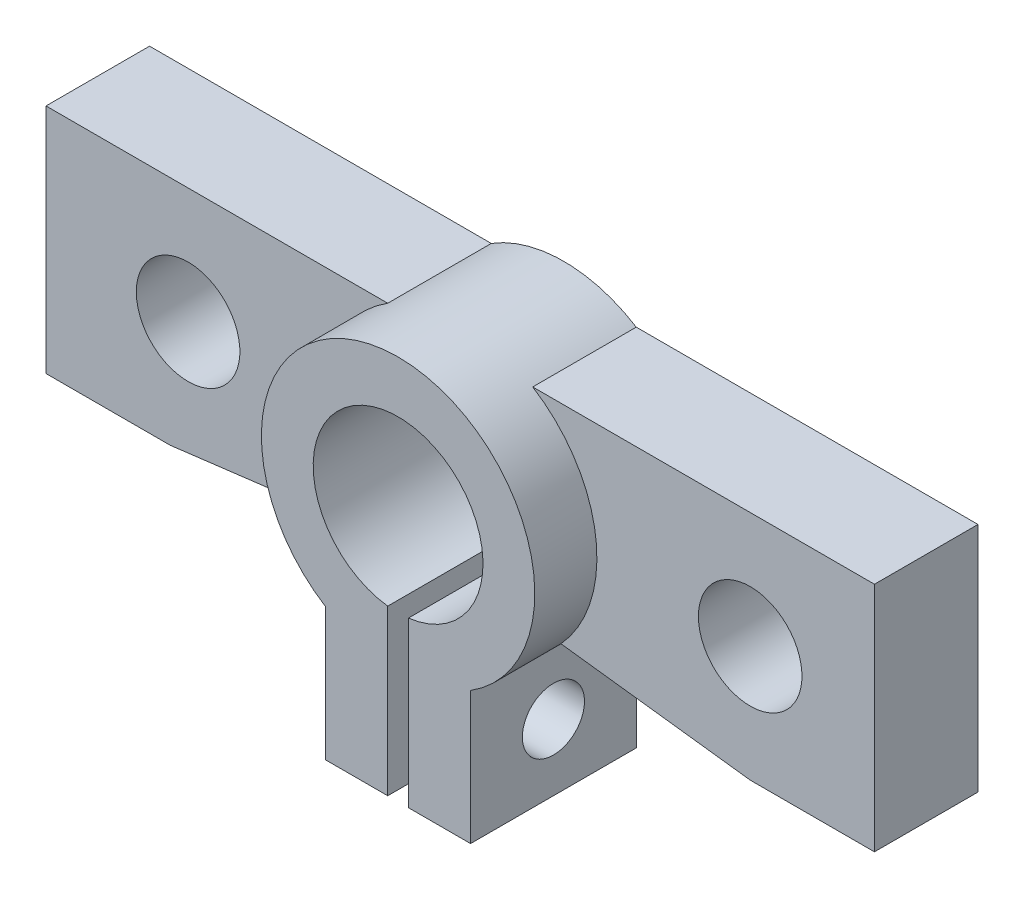
ISO-10303-21;
HEADER;
FILE_DESCRIPTION(('STEP AP214'),'2;1');
FILE_NAME('part.step','',(''),(''),'','','');
FILE_SCHEMA(('AUTOMOTIVE_DESIGN { 1 0 10303 214 1 1 1 1 }'));
ENDSEC;
DATA;
#1=APPLICATION_CONTEXT('core data for automotive mechanical design processes');
#2=APPLICATION_PROTOCOL_DEFINITION('international standard','automotive_design',2000,#1);
#3=PRODUCT_CONTEXT('',#1,'mechanical');
#4=PRODUCT('Part','Part','',(#3));
#5=PRODUCT_RELATED_PRODUCT_CATEGORY('part','',(#4));
#6=PRODUCT_DEFINITION_FORMATION('','',#4);
#7=PRODUCT_DEFINITION_CONTEXT('part definition',#1,'design');
#8=PRODUCT_DEFINITION('design','',#6,#7);
#9=PRODUCT_DEFINITION_SHAPE('','',#8);
#10=(LENGTH_UNIT() NAMED_UNIT(*) SI_UNIT(.MILLI.,.METRE.));
#11=(NAMED_UNIT(*) PLANE_ANGLE_UNIT() SI_UNIT($,.RADIAN.));
#12=(NAMED_UNIT(*) SI_UNIT($,.STERADIAN.) SOLID_ANGLE_UNIT());
#13=UNCERTAINTY_MEASURE_WITH_UNIT(LENGTH_MEASURE(1.E-05),#10,'distance_accuracy_value','');
#14=(GEOMETRIC_REPRESENTATION_CONTEXT(3) GLOBAL_UNCERTAINTY_ASSIGNED_CONTEXT((#13)) GLOBAL_UNIT_ASSIGNED_CONTEXT((#10,
#11,#12)) REPRESENTATION_CONTEXT('',''));
#15=CARTESIAN_POINT('',(0.,0.,0.));
#16=DIRECTION('',(0.,0.,1.));
#17=DIRECTION('',(1.,0.,0.));
#18=AXIS2_PLACEMENT_3D('',#15,#16,#17);
#19=CARTESIAN_POINT('',(0.,0.,8.));
#20=DIRECTION('',(0.,0.,-1.));
#21=DIRECTION('',(-1.,0.,0.));
#22=AXIS2_PLACEMENT_3D('',#19,#20,#21);
#23=CYLINDRICAL_SURFACE('',#22,6.6);
#24=DIRECTION('',(0.,0.,-1.));
#25=VECTOR('',#24,1.);
#26=CARTESIAN_POINT('',(3.50000000000012,5.59553393341503,5.));
#27=LINE('',#26,#25);
#28=CARTESIAN_POINT('',(3.50000000000012,5.59553393341503,5.));
#29=VERTEX_POINT('',#28);
#30=CARTESIAN_POINT('',(3.50000000000012,5.59553393341503,0.));
#31=VERTEX_POINT('',#30);
#32=EDGE_CURVE('E217',#29,#31,#27,.T.);
#33=ORIENTED_EDGE('',*,*,#32,.T.);
#34=CARTESIAN_POINT('',(0.,0.,0.));
#35=DIRECTION('',(0.,0.,1.));
#36=DIRECTION('',(1.,0.,0.));
#37=AXIS2_PLACEMENT_3D('',#34,#35,#36);
#38=CIRCLE('',#37,6.6);
#39=CARTESIAN_POINT('',(-3.50000000000012,5.59553393341503,0.));
#40=VERTEX_POINT('',#39);
#41=EDGE_CURVE('E307',#31,#40,#38,.T.);
#42=ORIENTED_EDGE('',*,*,#41,.T.);
#43=DIRECTION('',(0.,0.,-1.));
#44=VECTOR('',#43,1.);
#45=CARTESIAN_POINT('',(-3.50000000000012,5.59553393341503,5.));
#46=LINE('',#45,#44);
#47=CARTESIAN_POINT('',(-3.50000000000012,5.59553393341503,5.));
#48=VERTEX_POINT('',#47);
#49=EDGE_CURVE('E204',#48,#40,#46,.T.);
#50=ORIENTED_EDGE('',*,*,#49,.F.);
#51=CARTESIAN_POINT('',(0.,0.,5.));
#52=DIRECTION('',(0.,0.,-1.));
#53=DIRECTION('',(-1.,0.,0.));
#54=AXIS2_PLACEMENT_3D('',#51,#52,#53);
#55=CIRCLE('',#54,6.6);
#56=CARTESIAN_POINT('',(-4.86300158662899,-4.46219851289069,5.));
#57=VERTEX_POINT('',#56);
#58=EDGE_CURVE('E223',#57,#48,#55,.T.);
#59=ORIENTED_EDGE('',*,*,#58,.F.);
#60=DIRECTION('',(0.,0.,-1.));
#61=VECTOR('',#60,1.);
#62=CARTESIAN_POINT('',(-4.86300158662899,-4.46219851289069,5.));
#63=LINE('',#62,#61);
#64=CARTESIAN_POINT('',(-4.86300158662899,-4.46219851289069,0.));
#65=VERTEX_POINT('',#64);
#66=EDGE_CURVE('E236',#57,#65,#63,.T.);
#67=ORIENTED_EDGE('',*,*,#66,.T.);
#68=CARTESIAN_POINT('',(-3.49999999999988,-5.59553393341519,0.));
#69=VERTEX_POINT('',#68);
#70=EDGE_CURVE('E304',#65,#69,#38,.T.);
#71=ORIENTED_EDGE('',*,*,#70,.T.);
#72=DIRECTION('',(0.,0.,-1.));
#73=VECTOR('',#72,1.);
#74=CARTESIAN_POINT('',(-3.49999999999988,-5.59553393341519,8.));
#75=LINE('',#74,#73);
#76=CARTESIAN_POINT('',(-3.49999999999988,-5.59553393341519,8.));
#77=VERTEX_POINT('',#76);
#78=EDGE_CURVE('E311',#77,#69,#75,.T.);
#79=ORIENTED_EDGE('',*,*,#78,.F.);
#80=CARTESIAN_POINT('',(0.,0.,8.));
#81=DIRECTION('',(0.,0.,1.));
#82=DIRECTION('',(1.,0.,0.));
#83=AXIS2_PLACEMENT_3D('',#80,#81,#82);
#84=CIRCLE('',#83,6.6);
#85=CARTESIAN_POINT('',(3.50000000000012,-5.59553393341503,8.));
#86=VERTEX_POINT('',#85);
#87=EDGE_CURVE('E287',#86,#77,#84,.T.);
#88=ORIENTED_EDGE('',*,*,#87,.F.);
#89=DIRECTION('',(0.,0.,-1.));
#90=VECTOR('',#89,1.);
#91=CARTESIAN_POINT('',(3.50000000000012,-5.59553393341503,8.));
#92=LINE('',#91,#90);
#93=CARTESIAN_POINT('',(3.50000000000012,-5.59553393341503,0.));
#94=VERTEX_POINT('',#93);
#95=EDGE_CURVE('E314',#86,#94,#92,.T.);
#96=ORIENTED_EDGE('',*,*,#95,.T.);
#97=CARTESIAN_POINT('',(4.86300158662899,-4.46219851289069,0.));
#98=VERTEX_POINT('',#97);
#99=EDGE_CURVE('E305',#94,#98,#38,.T.);
#100=ORIENTED_EDGE('',*,*,#99,.T.);
#101=DIRECTION('',(0.,0.,-1.));
#102=VECTOR('',#101,1.);
#103=CARTESIAN_POINT('',(4.86300158662899,-4.46219851289069,5.));
#104=LINE('',#103,#102);
#105=CARTESIAN_POINT('',(4.86300158662899,-4.46219851289069,5.));
#106=VERTEX_POINT('',#105);
#107=EDGE_CURVE('E62',#106,#98,#104,.T.);
#108=ORIENTED_EDGE('',*,*,#107,.F.);
#109=CARTESIAN_POINT('',(0.,0.,5.));
#110=DIRECTION('',(0.,0.,-1.));
#111=DIRECTION('',(-1.,0.,0.));
#112=AXIS2_PLACEMENT_3D('',#109,#110,#111);
#113=CIRCLE('',#112,6.6);
#114=EDGE_CURVE('E66',#29,#106,#113,.T.);
#115=ORIENTED_EDGE('',*,*,#114,.F.);
#116=EDGE_LOOP('',(#33,#42,#50,#59,#67,#71,#79,#88,#96,#100,#108,#115));
#117=FACE_BOUND('',#116,.T.);
#118=ADVANCED_FACE('F47',(#117),#23,.T.);
#119=CARTESIAN_POINT('',(-3.49999999999988,-12.,8.));
#120=DIRECTION('',(0.,1.,0.));
#121=DIRECTION('',(0.,0.,1.));
#122=AXIS2_PLACEMENT_3D('',#119,#120,#121);
#123=PLANE('',#122);
#124=DIRECTION('',(1.,0.,0.));
#125=VECTOR('',#124,1.);
#126=CARTESIAN_POINT('',(-3.49999999999988,-12.,0.));
#127=LINE('',#126,#125);
#128=CARTESIAN_POINT('',(-3.49999999999988,-12.,0.));
#129=VERTEX_POINT('',#128);
#130=CARTESIAN_POINT('',(-0.499999999999876,-12.,0.));
#131=VERTEX_POINT('',#130);
#132=EDGE_CURVE('E272',#129,#131,#127,.T.);
#133=ORIENTED_EDGE('',*,*,#132,.T.);
#134=DIRECTION('',(0.,0.,-1.));
#135=VECTOR('',#134,1.);
#136=CARTESIAN_POINT('',(-0.499999999999876,-12.,8.));
#137=LINE('',#136,#135);
#138=CARTESIAN_POINT('',(-0.499999999999876,-12.,8.));
#139=VERTEX_POINT('',#138);
#140=EDGE_CURVE('E11',#139,#131,#137,.T.);
#141=ORIENTED_EDGE('',*,*,#140,.F.);
#142=DIRECTION('',(1.,0.,0.));
#143=VECTOR('',#142,1.);
#144=CARTESIAN_POINT('',(-3.49999999999988,-12.,8.));
#145=LINE('',#144,#143);
#146=CARTESIAN_POINT('',(-3.49999999999988,-12.,8.));
#147=VERTEX_POINT('',#146);
#148=EDGE_CURVE('E273',#147,#139,#145,.T.);
#149=ORIENTED_EDGE('',*,*,#148,.F.);
#150=DIRECTION('',(0.,0.,-1.));
#151=VECTOR('',#150,1.);
#152=CARTESIAN_POINT('',(-3.49999999999988,-12.,8.));
#153=LINE('',#152,#151);
#154=EDGE_CURVE('E291',#147,#129,#153,.T.);
#155=ORIENTED_EDGE('',*,*,#154,.T.);
#156=EDGE_LOOP('',(#133,#141,#149,#155));
#157=FACE_BOUND('',#156,.T.);
#158=ADVANCED_FACE('F49',(#157),#123,.F.);
#159=CARTESIAN_POINT('',(-0.499999999999876,-12.,8.));
#160=DIRECTION('',(-1.,0.,0.));
#161=DIRECTION('',(0.,-1.,0.));
#162=AXIS2_PLACEMENT_3D('',#159,#160,#161);
#163=PLANE('',#162);
#164=CARTESIAN_POINT('',(-0.499999999999926,-8.7977669667076,4.));
#165=DIRECTION('',(-1.,0.,0.));
#166=DIRECTION('',(0.,-1.,0.));
#167=AXIS2_PLACEMENT_3D('',#164,#165,#166);
#168=CIRCLE('',#167,1.5);
#169=CARTESIAN_POINT('',(-0.499999999999903,-10.2977669667076,4.));
#170=VERTEX_POINT('',#169);
#171=EDGE_CURVE('E269',#170,#170,#168,.T.);
#172=ORIENTED_EDGE('',*,*,#171,.T.);
#173=EDGE_LOOP('',(#172));
#174=FACE_BOUND('',#173,.T.);
#175=DIRECTION('',(0.,1.,0.));
#176=VECTOR('',#175,1.);
#177=CARTESIAN_POINT('',(-0.499999999999876,-12.,0.));
#178=LINE('',#177,#176);
#179=CARTESIAN_POINT('',(-0.499999999999998,-4.06939798987516,0.));
#180=VERTEX_POINT('',#179);
#181=EDGE_CURVE('E294',#131,#180,#178,.T.);
#182=ORIENTED_EDGE('',*,*,#181,.T.);
#183=DIRECTION('',(0.,0.,-1.));
#184=VECTOR('',#183,1.);
#185=CARTESIAN_POINT('',(-0.499999999999998,-4.06939798987516,8.));
#186=LINE('',#185,#184);
#187=CARTESIAN_POINT('',(-0.499999999999998,-4.06939798987516,8.));
#188=VERTEX_POINT('',#187);
#189=EDGE_CURVE('E55',#188,#180,#186,.T.);
#190=ORIENTED_EDGE('',*,*,#189,.F.);
#191=DIRECTION('',(0.,1.,0.));
#192=VECTOR('',#191,1.);
#193=CARTESIAN_POINT('',(-0.499999999999876,-12.,8.));
#194=LINE('',#193,#192);
#195=EDGE_CURVE('E276',#139,#188,#194,.T.);
#196=ORIENTED_EDGE('',*,*,#195,.F.);
#197=ORIENTED_EDGE('',*,*,#140,.T.);
#198=EDGE_LOOP('',(#182,#190,#196,#197));
#199=FACE_BOUND('',#198,.T.);
#200=ADVANCED_FACE('F354',(#174,#199),#163,.F.);
#201=CARTESIAN_POINT('',(0.,0.,8.));
#202=DIRECTION('',(0.,0.,-1.));
#203=DIRECTION('',(-1.,0.,0.));
#204=AXIS2_PLACEMENT_3D('',#201,#202,#203);
#205=CYLINDRICAL_SURFACE('',#204,4.1);
#206=CARTESIAN_POINT('',(0.,0.,0.));
#207=DIRECTION('',(0.,0.,-1.));
#208=DIRECTION('',(1.,0.,0.));
#209=AXIS2_PLACEMENT_3D('',#206,#207,#208);
#210=CIRCLE('',#209,4.1);
#211=CARTESIAN_POINT('',(0.500000000000002,-4.06939798987516,0.));
#212=VERTEX_POINT('',#211);
#213=EDGE_CURVE('E296',#180,#212,#210,.T.);
#214=ORIENTED_EDGE('',*,*,#213,.T.);
#215=DIRECTION('',(0.,0.,-1.));
#216=VECTOR('',#215,1.);
#217=CARTESIAN_POINT('',(0.500000000000002,-4.06939798987516,8.));
#218=LINE('',#217,#216);
#219=CARTESIAN_POINT('',(0.500000000000002,-4.06939798987516,8.));
#220=VERTEX_POINT('',#219);
#221=EDGE_CURVE('E323',#220,#212,#218,.T.);
#222=ORIENTED_EDGE('',*,*,#221,.F.);
#223=CARTESIAN_POINT('',(0.,0.,8.));
#224=DIRECTION('',(0.,0.,-1.));
#225=DIRECTION('',(1.,0.,0.));
#226=AXIS2_PLACEMENT_3D('',#223,#224,#225);
#227=CIRCLE('',#226,4.1);
#228=EDGE_CURVE('E279',#188,#220,#227,.T.);
#229=ORIENTED_EDGE('',*,*,#228,.F.);
#230=ORIENTED_EDGE('',*,*,#189,.T.);
#231=EDGE_LOOP('',(#214,#222,#229,#230));
#232=FACE_BOUND('',#231,.T.);
#233=ADVANCED_FACE('F330',(#232),#205,.F.);
#234=CARTESIAN_POINT('',(0.500000000000124,-12.,8.));
#235=DIRECTION('',(1.,0.,0.));
#236=DIRECTION('',(0.,1.,0.));
#237=AXIS2_PLACEMENT_3D('',#234,#235,#236);
#238=PLANE('',#237);
#239=CARTESIAN_POINT('',(0.500000000000074,-8.7977669667076,4.));
#240=DIRECTION('',(1.,0.,0.));
#241=DIRECTION('',(0.,1.,0.));
#242=AXIS2_PLACEMENT_3D('',#239,#240,#241);
#243=CIRCLE('',#242,1.5);
#244=CARTESIAN_POINT('',(0.500000000000051,-7.2977669667076,4.));
#245=VERTEX_POINT('',#244);
#246=EDGE_CURVE('E266',#245,#245,#243,.T.);
#247=ORIENTED_EDGE('',*,*,#246,.T.);
#248=EDGE_LOOP('',(#247));
#249=FACE_BOUND('',#248,.T.);
#250=DIRECTION('',(0.,-1.,0.));
#251=VECTOR('',#250,1.);
#252=CARTESIAN_POINT('',(0.500000000000124,-12.,0.));
#253=LINE('',#252,#251);
#254=CARTESIAN_POINT('',(0.500000000000124,-12.,0.));
#255=VERTEX_POINT('',#254);
#256=EDGE_CURVE('E298',#212,#255,#253,.T.);
#257=ORIENTED_EDGE('',*,*,#256,.T.);
#258=DIRECTION('',(0.,0.,-1.));
#259=VECTOR('',#258,1.);
#260=CARTESIAN_POINT('',(0.500000000000124,-12.,8.));
#261=LINE('',#260,#259);
#262=CARTESIAN_POINT('',(0.500000000000124,-12.,8.));
#263=VERTEX_POINT('',#262);
#264=EDGE_CURVE('E320',#263,#255,#261,.T.);
#265=ORIENTED_EDGE('',*,*,#264,.F.);
#266=DIRECTION('',(0.,-1.,0.));
#267=VECTOR('',#266,1.);
#268=CARTESIAN_POINT('',(0.500000000000124,-12.,8.));
#269=LINE('',#268,#267);
#270=EDGE_CURVE('E281',#220,#263,#269,.T.);
#271=ORIENTED_EDGE('',*,*,#270,.F.);
#272=ORIENTED_EDGE('',*,*,#221,.T.);
#273=EDGE_LOOP('',(#257,#265,#271,#272));
#274=FACE_BOUND('',#273,.T.);
#275=ADVANCED_FACE('F342',(#249,#274),#238,.F.);
#276=CARTESIAN_POINT('',(0.500000000000124,-12.,8.));
#277=DIRECTION('',(0.,1.,0.));
#278=DIRECTION('',(0.,0.,1.));
#279=AXIS2_PLACEMENT_3D('',#276,#277,#278);
#280=PLANE('',#279);
#281=DIRECTION('',(1.,0.,0.));
#282=VECTOR('',#281,1.);
#283=CARTESIAN_POINT('',(0.500000000000124,-12.,0.));
#284=LINE('',#283,#282);
#285=CARTESIAN_POINT('',(3.50000000000012,-12.,0.));
#286=VERTEX_POINT('',#285);
#287=EDGE_CURVE('E300',#255,#286,#284,.T.);
#288=ORIENTED_EDGE('',*,*,#287,.T.);
#289=DIRECTION('',(0.,0.,-1.));
#290=VECTOR('',#289,1.);
#291=CARTESIAN_POINT('',(3.50000000000012,-12.,8.));
#292=LINE('',#291,#290);
#293=CARTESIAN_POINT('',(3.50000000000012,-12.,8.));
#294=VERTEX_POINT('',#293);
#295=EDGE_CURVE('E317',#294,#286,#292,.T.);
#296=ORIENTED_EDGE('',*,*,#295,.F.);
#297=DIRECTION('',(1.,0.,0.));
#298=VECTOR('',#297,1.);
#299=CARTESIAN_POINT('',(0.500000000000124,-12.,8.));
#300=LINE('',#299,#298);
#301=EDGE_CURVE('E283',#263,#294,#300,.T.);
#302=ORIENTED_EDGE('',*,*,#301,.F.);
#303=ORIENTED_EDGE('',*,*,#264,.T.);
#304=EDGE_LOOP('',(#288,#296,#302,#303));
#305=FACE_BOUND('',#304,.T.);
#306=ADVANCED_FACE('F346',(#305),#280,.F.);
#307=CARTESIAN_POINT('',(3.50000000000012,-12.,8.));
#308=DIRECTION('',(-1.,0.,0.));
#309=DIRECTION('',(0.,0.,1.));
#310=AXIS2_PLACEMENT_3D('',#307,#308,#309);
#311=PLANE('',#310);
#312=CARTESIAN_POINT('',(3.50000000000012,-8.7977669667076,4.));
#313=DIRECTION('',(-1.,0.,0.));
#314=DIRECTION('',(0.,0.,1.));
#315=AXIS2_PLACEMENT_3D('',#312,#313,#314);
#316=CIRCLE('',#315,1.5);
#317=CARTESIAN_POINT('',(3.50000000000012,-8.7977669667076,5.5));
#318=VERTEX_POINT('',#317);
#319=EDGE_CURVE('E263',#318,#318,#316,.T.);
#320=ORIENTED_EDGE('',*,*,#319,.T.);
#321=EDGE_LOOP('',(#320));
#322=FACE_BOUND('',#321,.T.);
#323=DIRECTION('',(0.,1.,0.));
#324=VECTOR('',#323,1.);
#325=CARTESIAN_POINT('',(3.50000000000012,-12.,0.));
#326=LINE('',#325,#324);
#327=EDGE_CURVE('E302',#286,#94,#326,.T.);
#328=ORIENTED_EDGE('',*,*,#327,.T.);
#329=ORIENTED_EDGE('',*,*,#95,.F.);
#330=DIRECTION('',(0.,1.,0.));
#331=VECTOR('',#330,1.);
#332=CARTESIAN_POINT('',(3.50000000000012,-12.,8.));
#333=LINE('',#332,#331);
#334=EDGE_CURVE('E285',#294,#86,#333,.T.);
#335=ORIENTED_EDGE('',*,*,#334,.F.);
#336=ORIENTED_EDGE('',*,*,#295,.T.);
#337=EDGE_LOOP('',(#328,#329,#335,#336));
#338=FACE_BOUND('',#337,.T.);
#339=ADVANCED_FACE('F407',(#322,#338),#311,.F.);
#340=CARTESIAN_POINT('',(-3.49999999999988,-12.,8.));
#341=DIRECTION('',(1.,0.,0.));
#342=DIRECTION('',(0.,1.,0.));
#343=AXIS2_PLACEMENT_3D('',#340,#341,#342);
#344=PLANE('',#343);
#345=CARTESIAN_POINT('',(-3.49999999999987,-8.7977669667076,4.));
#346=DIRECTION('',(-1.,0.,0.));
#347=DIRECTION('',(0.,-1.,0.));
#348=AXIS2_PLACEMENT_3D('',#345,#346,#347);
#349=CIRCLE('',#348,1.5);
#350=CARTESIAN_POINT('',(-3.49999999999987,-10.2977669667076,4.));
#351=VERTEX_POINT('',#350);
#352=EDGE_CURVE('E213',#351,#351,#349,.T.);
#353=ORIENTED_EDGE('',*,*,#352,.F.);
#354=EDGE_LOOP('',(#353));
#355=FACE_BOUND('',#354,.T.);
#356=DIRECTION('',(0.,-1.,0.));
#357=VECTOR('',#356,1.);
#358=CARTESIAN_POINT('',(-3.49999999999988,-12.,0.));
#359=LINE('',#358,#357);
#360=EDGE_CURVE('E277',#69,#129,#359,.T.);
#361=ORIENTED_EDGE('',*,*,#360,.T.);
#362=ORIENTED_EDGE('',*,*,#154,.F.);
#363=DIRECTION('',(0.,-1.,0.));
#364=VECTOR('',#363,1.);
#365=CARTESIAN_POINT('',(-3.49999999999988,-12.,8.));
#366=LINE('',#365,#364);
#367=EDGE_CURVE('E289',#77,#147,#366,.T.);
#368=ORIENTED_EDGE('',*,*,#367,.F.);
#369=ORIENTED_EDGE('',*,*,#78,.T.);
#370=EDGE_LOOP('',(#361,#362,#368,#369));
#371=FACE_BOUND('',#370,.T.);
#372=ADVANCED_FACE('F359',(#355,#371),#344,.F.);
#373=CARTESIAN_POINT('',(0.,0.,8.));
#374=DIRECTION('',(0.,0.,1.));
#375=DIRECTION('',(1.,0.,0.));
#376=AXIS2_PLACEMENT_3D('',#373,#374,#375);
#377=PLANE('',#376);
#378=ORIENTED_EDGE('',*,*,#148,.T.);
#379=ORIENTED_EDGE('',*,*,#195,.T.);
#380=ORIENTED_EDGE('',*,*,#228,.T.);
#381=ORIENTED_EDGE('',*,*,#270,.T.);
#382=ORIENTED_EDGE('',*,*,#301,.T.);
#383=ORIENTED_EDGE('',*,*,#334,.T.);
#384=ORIENTED_EDGE('',*,*,#87,.T.);
#385=ORIENTED_EDGE('',*,*,#367,.T.);
#386=EDGE_LOOP('',(#378,#379,#380,#381,#382,#383,#384,#385));
#387=FACE_BOUND('',#386,.T.);
#388=ADVANCED_FACE('F350',(#387),#377,.T.);
#389=CARTESIAN_POINT('',(0.,0.,0.));
#390=DIRECTION('',(0.,0.,1.));
#391=DIRECTION('',(1.,0.,0.));
#392=AXIS2_PLACEMENT_3D('',#389,#390,#391);
#393=PLANE('',#392);
#394=ORIENTED_EDGE('',*,*,#132,.F.);
#395=ORIENTED_EDGE('',*,*,#360,.F.);
#396=ORIENTED_EDGE('',*,*,#70,.F.);
#397=DIRECTION('',(-0.99239492558108,-0.123094726454561,0.));
#398=VECTOR('',#397,1.);
#399=CARTESIAN_POINT('',(0.471410126742453,-3.80052851264459,0.));
#400=LINE('',#399,#398);
#401=CARTESIAN_POINT('',(-14.,-5.59553393341503,0.));
#402=VERTEX_POINT('',#401);
#403=EDGE_CURVE('E240',#65,#402,#400,.T.);
#404=ORIENTED_EDGE('',*,*,#403,.T.);
#405=DIRECTION('',(1.,0.,0.));
#406=VECTOR('',#405,1.);
#407=CARTESIAN_POINT('',(1.42364993098816E-13,-5.59553393341468,0.));
#408=LINE('',#407,#406);
#409=CARTESIAN_POINT('',(-20.,-5.59553393341519,0.));
#410=VERTEX_POINT('',#409);
#411=EDGE_CURVE('E243',#410,#402,#408,.T.);
#412=ORIENTED_EDGE('',*,*,#411,.F.);
#413=DIRECTION('',(0.,-1.,0.));
#414=VECTOR('',#413,1.);
#415=CARTESIAN_POINT('',(-20.,0.,0.));
#416=LINE('',#415,#414);
#417=CARTESIAN_POINT('',(-20.,5.59553393341519,0.));
#418=VERTEX_POINT('',#417);
#419=EDGE_CURVE('E246',#418,#410,#416,.T.);
#420=ORIENTED_EDGE('',*,*,#419,.F.);
#421=DIRECTION('',(-1.,0.,0.));
#422=VECTOR('',#421,1.);
#423=CARTESIAN_POINT('',(0.,5.595533933415,0.));
#424=LINE('',#423,#422);
#425=EDGE_CURVE('E224',#40,#418,#424,.T.);
#426=ORIENTED_EDGE('',*,*,#425,.F.);
#427=ORIENTED_EDGE('',*,*,#41,.F.);
#428=DIRECTION('',(-1.,0.,0.));
#429=VECTOR('',#428,1.);
#430=CARTESIAN_POINT('',(0.,5.595533933415,0.));
#431=LINE('',#430,#429);
#432=CARTESIAN_POINT('',(20.,5.59553393341519,0.));
#433=VERTEX_POINT('',#432);
#434=EDGE_CURVE('E207',#433,#31,#431,.T.);
#435=ORIENTED_EDGE('',*,*,#434,.F.);
#436=DIRECTION('',(0.,1.,0.));
#437=VECTOR('',#436,1.);
#438=CARTESIAN_POINT('',(20.,0.,0.));
#439=LINE('',#438,#437);
#440=CARTESIAN_POINT('',(20.,-5.59553393341519,0.));
#441=VERTEX_POINT('',#440);
#442=EDGE_CURVE('E210',#441,#433,#439,.T.);
#443=ORIENTED_EDGE('',*,*,#442,.F.);
#444=DIRECTION('',(1.,0.,0.));
#445=VECTOR('',#444,1.);
#446=CARTESIAN_POINT('',(-1.42364993098816E-13,-5.59553393341468,0.));
#447=LINE('',#446,#445);
#448=CARTESIAN_POINT('',(14.,-5.59553393341504,0.));
#449=VERTEX_POINT('',#448);
#450=EDGE_CURVE('E203',#449,#441,#447,.T.);
#451=ORIENTED_EDGE('',*,*,#450,.F.);
#452=DIRECTION('',(-0.99239492558108,0.123094726454561,0.));
#453=VECTOR('',#452,1.);
#454=CARTESIAN_POINT('',(-0.471410126742453,-3.80052851264459,0.));
#455=LINE('',#454,#453);
#456=EDGE_CURVE('E177',#449,#98,#455,.T.);
#457=ORIENTED_EDGE('',*,*,#456,.T.);
#458=ORIENTED_EDGE('',*,*,#99,.F.);
#459=ORIENTED_EDGE('',*,*,#327,.F.);
#460=ORIENTED_EDGE('',*,*,#287,.F.);
#461=ORIENTED_EDGE('',*,*,#256,.F.);
#462=ORIENTED_EDGE('',*,*,#213,.F.);
#463=ORIENTED_EDGE('',*,*,#181,.F.);
#464=EDGE_LOOP('',(#394,#395,#396,#404,#412,#420,#426,#427,#435,#443,#451,#457,#458,#459,#460,
#461,#462,#463));
#465=FACE_BOUND('',#464,.T.);
#466=CARTESIAN_POINT('',(-13.1393561181557,0.,0.));
#467=DIRECTION('',(0.,0.,-1.));
#468=DIRECTION('',(-1.,0.,0.));
#469=AXIS2_PLACEMENT_3D('',#466,#467,#468);
#470=CIRCLE('',#469,2.5);
#471=CARTESIAN_POINT('',(-15.6393561181557,0.,0.));
#472=VERTEX_POINT('',#471);
#473=EDGE_CURVE('E237',#472,#472,#470,.T.);
#474=ORIENTED_EDGE('',*,*,#473,.F.);
#475=EDGE_LOOP('',(#474));
#476=FACE_BOUND('',#475,.T.);
#477=CARTESIAN_POINT('',(14.,0.,0.));
#478=DIRECTION('',(0.,0.,-1.));
#479=DIRECTION('',(-1.,0.,0.));
#480=AXIS2_PLACEMENT_3D('',#477,#478,#479);
#481=CIRCLE('',#480,2.5);
#482=CARTESIAN_POINT('',(11.5,0.,0.));
#483=VERTEX_POINT('',#482);
#484=EDGE_CURVE('E200',#483,#483,#481,.T.);
#485=ORIENTED_EDGE('',*,*,#484,.F.);
#486=EDGE_LOOP('',(#485));
#487=FACE_BOUND('',#486,.T.);
#488=ADVANCED_FACE('F336',(#465,#476,#487),#393,.F.);
#489=CARTESIAN_POINT('',(4.50000000000013,-8.7977669667076,4.));
#490=DIRECTION('',(-1.,0.,0.));
#491=DIRECTION('',(0.,-1.,0.));
#492=AXIS2_PLACEMENT_3D('',#489,#490,#491);
#493=CYLINDRICAL_SURFACE('',#492,1.5);
#494=ORIENTED_EDGE('',*,*,#352,.T.);
#495=EDGE_LOOP('',(#494));
#496=FACE_BOUND('',#495,.T.);
#497=ORIENTED_EDGE('',*,*,#171,.F.);
#498=EDGE_LOOP('',(#497));
#499=FACE_BOUND('',#498,.T.);
#500=ADVANCED_FACE('F424',(#496,#499),#493,.F.);
#501=ORIENTED_EDGE('',*,*,#319,.F.);
#502=EDGE_LOOP('',(#501));
#503=FACE_BOUND('',#502,.T.);
#504=ORIENTED_EDGE('',*,*,#246,.F.);
#505=EDGE_LOOP('',(#504));
#506=FACE_BOUND('',#505,.T.);
#507=ADVANCED_FACE('F395',(#503,#506),#493,.F.);
#508=CARTESIAN_POINT('',(0.,5.595533933415,5.));
#509=DIRECTION('',(0.,-1.,0.));
#510=DIRECTION('',(1.,0.,0.));
#511=AXIS2_PLACEMENT_3D('',#508,#509,#510);
#512=PLANE('',#511);
#513=ORIENTED_EDGE('',*,*,#425,.T.);
#514=DIRECTION('',(0.,0.,-1.));
#515=VECTOR('',#514,1.);
#516=CARTESIAN_POINT('',(-20.,5.59553393341519,5.));
#517=LINE('',#516,#515);
#518=CARTESIAN_POINT('',(-20.,5.59553393341519,5.));
#519=VERTEX_POINT('',#518);
#520=EDGE_CURVE('E251',#519,#418,#517,.T.);
#521=ORIENTED_EDGE('',*,*,#520,.F.);
#522=DIRECTION('',(-1.,0.,0.));
#523=VECTOR('',#522,1.);
#524=CARTESIAN_POINT('',(0.,5.595533933415,5.));
#525=LINE('',#524,#523);
#526=EDGE_CURVE('E234',#48,#519,#525,.T.);
#527=ORIENTED_EDGE('',*,*,#526,.F.);
#528=ORIENTED_EDGE('',*,*,#49,.T.);
#529=EDGE_LOOP('',(#513,#521,#527,#528));
#530=FACE_BOUND('',#529,.T.);
#531=ADVANCED_FACE('F373',(#530),#512,.F.);
#532=CARTESIAN_POINT('',(-20.,0.,5.));
#533=DIRECTION('',(1.,0.,0.));
#534=DIRECTION('',(0.,0.,-1.));
#535=AXIS2_PLACEMENT_3D('',#532,#533,#534);
#536=PLANE('',#535);
#537=ORIENTED_EDGE('',*,*,#419,.T.);
#538=DIRECTION('',(0.,0.,-1.));
#539=VECTOR('',#538,1.);
#540=CARTESIAN_POINT('',(-20.,-5.59553393341519,5.));
#541=LINE('',#540,#539);
#542=CARTESIAN_POINT('',(-20.,-5.59553393341519,5.));
#543=VERTEX_POINT('',#542);
#544=EDGE_CURVE('E254',#543,#410,#541,.T.);
#545=ORIENTED_EDGE('',*,*,#544,.F.);
#546=DIRECTION('',(0.,-1.,0.));
#547=VECTOR('',#546,1.);
#548=CARTESIAN_POINT('',(-20.,0.,5.));
#549=LINE('',#548,#547);
#550=EDGE_CURVE('E232',#519,#543,#549,.T.);
#551=ORIENTED_EDGE('',*,*,#550,.F.);
#552=ORIENTED_EDGE('',*,*,#520,.T.);
#553=EDGE_LOOP('',(#537,#545,#551,#552));
#554=FACE_BOUND('',#553,.T.);
#555=ADVANCED_FACE('F386',(#554),#536,.F.);
#556=CARTESIAN_POINT('',(1.42364993098816E-13,-5.59553393341468,5.));
#557=DIRECTION('',(0.,1.,0.));
#558=DIRECTION('',(-1.,0.,0.));
#559=AXIS2_PLACEMENT_3D('',#556,#557,#558);
#560=PLANE('',#559);
#561=ORIENTED_EDGE('',*,*,#411,.T.);
#562=DIRECTION('',(0.,0.,-1.));
#563=VECTOR('',#562,1.);
#564=CARTESIAN_POINT('',(-14.,-5.59553393341503,5.));
#565=LINE('',#564,#563);
#566=CARTESIAN_POINT('',(-14.,-5.59553393341503,5.));
#567=VERTEX_POINT('',#566);
#568=EDGE_CURVE('E257',#567,#402,#565,.T.);
#569=ORIENTED_EDGE('',*,*,#568,.F.);
#570=DIRECTION('',(1.,0.,0.));
#571=VECTOR('',#570,1.);
#572=CARTESIAN_POINT('',(1.42364993098816E-13,-5.59553393341468,5.));
#573=LINE('',#572,#571);
#574=EDGE_CURVE('E230',#543,#567,#573,.T.);
#575=ORIENTED_EDGE('',*,*,#574,.F.);
#576=ORIENTED_EDGE('',*,*,#544,.T.);
#577=EDGE_LOOP('',(#561,#569,#575,#576));
#578=FACE_BOUND('',#577,.T.);
#579=ADVANCED_FACE('F382',(#578),#560,.F.);
#580=CARTESIAN_POINT('',(-13.1393561181557,0.,5.));
#581=DIRECTION('',(0.,0.,-1.));
#582=DIRECTION('',(-1.,0.,0.));
#583=AXIS2_PLACEMENT_3D('',#580,#581,#582);
#584=CYLINDRICAL_SURFACE('',#583,2.5);
#585=CARTESIAN_POINT('',(-13.1393561181557,0.,5.));
#586=DIRECTION('',(0.,0.,-1.));
#587=DIRECTION('',(-1.,0.,0.));
#588=AXIS2_PLACEMENT_3D('',#585,#586,#587);
#589=CIRCLE('',#588,2.5);
#590=CARTESIAN_POINT('',(-15.6393561181557,0.,5.));
#591=VERTEX_POINT('',#590);
#592=EDGE_CURVE('E220',#591,#591,#589,.T.);
#593=ORIENTED_EDGE('',*,*,#592,.F.);
#594=EDGE_LOOP('',(#593));
#595=FACE_BOUND('',#594,.T.);
#596=ORIENTED_EDGE('',*,*,#473,.T.);
#597=EDGE_LOOP('',(#596));
#598=FACE_BOUND('',#597,.T.);
#599=ADVANCED_FACE('F393',(#595,#598),#584,.F.);
#600=CARTESIAN_POINT('',(0.471410126742453,-3.80052851264459,5.));
#601=DIRECTION('',(0.123094726454561,-0.99239492558108,0.));
#602=DIRECTION('',(0.99239492558108,0.123094726454561,0.));
#603=AXIS2_PLACEMENT_3D('',#600,#601,#602);
#604=PLANE('',#603);
#605=ORIENTED_EDGE('',*,*,#403,.F.);
#606=ORIENTED_EDGE('',*,*,#66,.F.);
#607=DIRECTION('',(-0.99239492558108,-0.123094726454561,0.));
#608=VECTOR('',#607,1.);
#609=CARTESIAN_POINT('',(0.471410126742453,-3.80052851264459,5.));
#610=LINE('',#609,#608);
#611=EDGE_CURVE('E227',#57,#567,#610,.T.);
#612=ORIENTED_EDGE('',*,*,#611,.T.);
#613=ORIENTED_EDGE('',*,*,#568,.T.);
#614=EDGE_LOOP('',(#605,#606,#612,#613));
#615=FACE_BOUND('',#614,.T.);
#616=ADVANCED_FACE('F379',(#615),#604,.T.);
#617=CARTESIAN_POINT('',(0.,0.,5.));
#618=DIRECTION('',(0.,0.,-1.));
#619=DIRECTION('',(-1.,0.,0.));
#620=AXIS2_PLACEMENT_3D('',#617,#618,#619);
#621=PLANE('',#620);
#622=ORIENTED_EDGE('',*,*,#592,.T.);
#623=EDGE_LOOP('',(#622));
#624=FACE_BOUND('',#623,.T.);
#625=ORIENTED_EDGE('',*,*,#58,.T.);
#626=ORIENTED_EDGE('',*,*,#526,.T.);
#627=ORIENTED_EDGE('',*,*,#550,.T.);
#628=ORIENTED_EDGE('',*,*,#574,.T.);
#629=ORIENTED_EDGE('',*,*,#611,.F.);
#630=EDGE_LOOP('',(#625,#626,#627,#628,#629));
#631=FACE_BOUND('',#630,.T.);
#632=ADVANCED_FACE('F377',(#624,#631),#621,.F.);
#633=CARTESIAN_POINT('',(-1.42364993098816E-13,-5.59553393341468,5.));
#634=DIRECTION('',(0.,1.,0.));
#635=DIRECTION('',(-1.,0.,0.));
#636=AXIS2_PLACEMENT_3D('',#633,#634,#635);
#637=PLANE('',#636);
#638=ORIENTED_EDGE('',*,*,#450,.T.);
#639=DIRECTION('',(0.,0.,-1.));
#640=VECTOR('',#639,1.);
#641=CARTESIAN_POINT('',(20.,-5.59553393341519,5.));
#642=LINE('',#641,#640);
#643=CARTESIAN_POINT('',(20.,-5.59553393341519,5.));
#644=VERTEX_POINT('',#643);
#645=EDGE_CURVE('E188',#644,#441,#642,.T.);
#646=ORIENTED_EDGE('',*,*,#645,.F.);
#647=DIRECTION('',(1.,0.,0.));
#648=VECTOR('',#647,1.);
#649=CARTESIAN_POINT('',(-1.42364993098816E-13,-5.59553393341468,5.));
#650=LINE('',#649,#648);
#651=CARTESIAN_POINT('',(14.,-5.59553393341504,5.));
#652=VERTEX_POINT('',#651);
#653=EDGE_CURVE('E185',#652,#644,#650,.T.);
#654=ORIENTED_EDGE('',*,*,#653,.F.);
#655=DIRECTION('',(0.,0.,-1.));
#656=VECTOR('',#655,1.);
#657=CARTESIAN_POINT('',(14.,-5.59553393341504,5.));
#658=LINE('',#657,#656);
#659=EDGE_CURVE('E171',#652,#449,#658,.T.);
#660=ORIENTED_EDGE('',*,*,#659,.T.);
#661=EDGE_LOOP('',(#638,#646,#654,#660));
#662=FACE_BOUND('',#661,.T.);
#663=ADVANCED_FACE('F186',(#662),#637,.F.);
#664=CARTESIAN_POINT('',(20.,0.,5.));
#665=DIRECTION('',(-1.,0.,0.));
#666=DIRECTION('',(0.,0.,1.));
#667=AXIS2_PLACEMENT_3D('',#664,#665,#666);
#668=PLANE('',#667);
#669=ORIENTED_EDGE('',*,*,#442,.T.);
#670=DIRECTION('',(0.,0.,-1.));
#671=VECTOR('',#670,1.);
#672=CARTESIAN_POINT('',(20.,5.59553393341519,5.));
#673=LINE('',#672,#671);
#674=CARTESIAN_POINT('',(20.,5.59553393341519,5.));
#675=VERTEX_POINT('',#674);
#676=EDGE_CURVE('E214',#675,#433,#673,.T.);
#677=ORIENTED_EDGE('',*,*,#676,.F.);
#678=DIRECTION('',(0.,1.,0.));
#679=VECTOR('',#678,1.);
#680=CARTESIAN_POINT('',(20.,0.,5.));
#681=LINE('',#680,#679);
#682=EDGE_CURVE('E181',#644,#675,#681,.T.);
#683=ORIENTED_EDGE('',*,*,#682,.F.);
#684=ORIENTED_EDGE('',*,*,#645,.T.);
#685=EDGE_LOOP('',(#669,#677,#683,#684));
#686=FACE_BOUND('',#685,.T.);
#687=ADVANCED_FACE('F543',(#686),#668,.F.);
#688=CARTESIAN_POINT('',(0.,5.595533933415,5.));
#689=DIRECTION('',(0.,-1.,0.));
#690=DIRECTION('',(1.,0.,0.));
#691=AXIS2_PLACEMENT_3D('',#688,#689,#690);
#692=PLANE('',#691);
#693=ORIENTED_EDGE('',*,*,#434,.T.);
#694=ORIENTED_EDGE('',*,*,#32,.F.);
#695=DIRECTION('',(-1.,0.,0.));
#696=VECTOR('',#695,1.);
#697=CARTESIAN_POINT('',(0.,5.595533933415,5.));
#698=LINE('',#697,#696);
#699=EDGE_CURVE('E194',#675,#29,#698,.T.);
#700=ORIENTED_EDGE('',*,*,#699,.F.);
#701=ORIENTED_EDGE('',*,*,#676,.T.);
#702=EDGE_LOOP('',(#693,#694,#700,#701));
#703=FACE_BOUND('',#702,.T.);
#704=ADVANCED_FACE('F551',(#703),#692,.F.);
#705=CARTESIAN_POINT('',(14.,0.,5.));
#706=DIRECTION('',(0.,0.,-1.));
#707=DIRECTION('',(-1.,0.,0.));
#708=AXIS2_PLACEMENT_3D('',#705,#706,#707);
#709=CYLINDRICAL_SURFACE('',#708,2.5);
#710=CARTESIAN_POINT('',(14.,0.,5.));
#711=DIRECTION('',(0.,0.,-1.));
#712=DIRECTION('',(-1.,0.,0.));
#713=AXIS2_PLACEMENT_3D('',#710,#711,#712);
#714=CIRCLE('',#713,2.5);
#715=CARTESIAN_POINT('',(11.5,0.,5.));
#716=VERTEX_POINT('',#715);
#717=EDGE_CURVE('E190',#716,#716,#714,.T.);
#718=ORIENTED_EDGE('',*,*,#717,.F.);
#719=EDGE_LOOP('',(#718));
#720=FACE_BOUND('',#719,.T.);
#721=ORIENTED_EDGE('',*,*,#484,.T.);
#722=EDGE_LOOP('',(#721));
#723=FACE_BOUND('',#722,.T.);
#724=ADVANCED_FACE('F560',(#720,#723),#709,.F.);
#725=CARTESIAN_POINT('',(-0.471410126742453,-3.80052851264459,5.));
#726=DIRECTION('',(-0.123094726454561,-0.99239492558108,0.));
#727=DIRECTION('',(0.99239492558108,-0.123094726454561,0.));
#728=AXIS2_PLACEMENT_3D('',#725,#726,#727);
#729=PLANE('',#728);
#730=ORIENTED_EDGE('',*,*,#456,.F.);
#731=ORIENTED_EDGE('',*,*,#659,.F.);
#732=DIRECTION('',(-0.99239492558108,0.123094726454561,0.));
#733=VECTOR('',#732,1.);
#734=CARTESIAN_POINT('',(-0.471410126742453,-3.80052851264459,5.));
#735=LINE('',#734,#733);
#736=EDGE_CURVE('E175',#652,#106,#735,.T.);
#737=ORIENTED_EDGE('',*,*,#736,.T.);
#738=ORIENTED_EDGE('',*,*,#107,.T.);
#739=EDGE_LOOP('',(#730,#731,#737,#738));
#740=FACE_BOUND('',#739,.T.);
#741=ADVANCED_FACE('F173',(#740),#729,.T.);
#742=CARTESIAN_POINT('',(0.,0.,5.));
#743=DIRECTION('',(0.,0.,-1.));
#744=DIRECTION('',(-1.,0.,0.));
#745=AXIS2_PLACEMENT_3D('',#742,#743,#744);
#746=PLANE('',#745);
#747=ORIENTED_EDGE('',*,*,#717,.T.);
#748=EDGE_LOOP('',(#747));
#749=FACE_BOUND('',#748,.T.);
#750=ORIENTED_EDGE('',*,*,#653,.T.);
#751=ORIENTED_EDGE('',*,*,#682,.T.);
#752=ORIENTED_EDGE('',*,*,#699,.T.);
#753=ORIENTED_EDGE('',*,*,#114,.T.);
#754=ORIENTED_EDGE('',*,*,#736,.F.);
#755=EDGE_LOOP('',(#750,#751,#752,#753,#754));
#756=FACE_BOUND('',#755,.T.);
#757=ADVANCED_FACE('F192',(#749,#756),#746,.F.);
#758=CLOSED_SHELL('',(#118,#158,#200,#233,#275,#306,#339,#372,#388,#488,#500,#507,#531,#555,
#579,#599,#616,#632,#663,#687,#704,#724,#741,#757));
#759=MANIFOLD_SOLID_BREP('B2',#758);
#760=ADVANCED_BREP_SHAPE_REPRESENTATION('',(#18,#759),#14);
#761=SHAPE_DEFINITION_REPRESENTATION(#9,#760);
ENDSEC;
END-ISO-10303-21;
